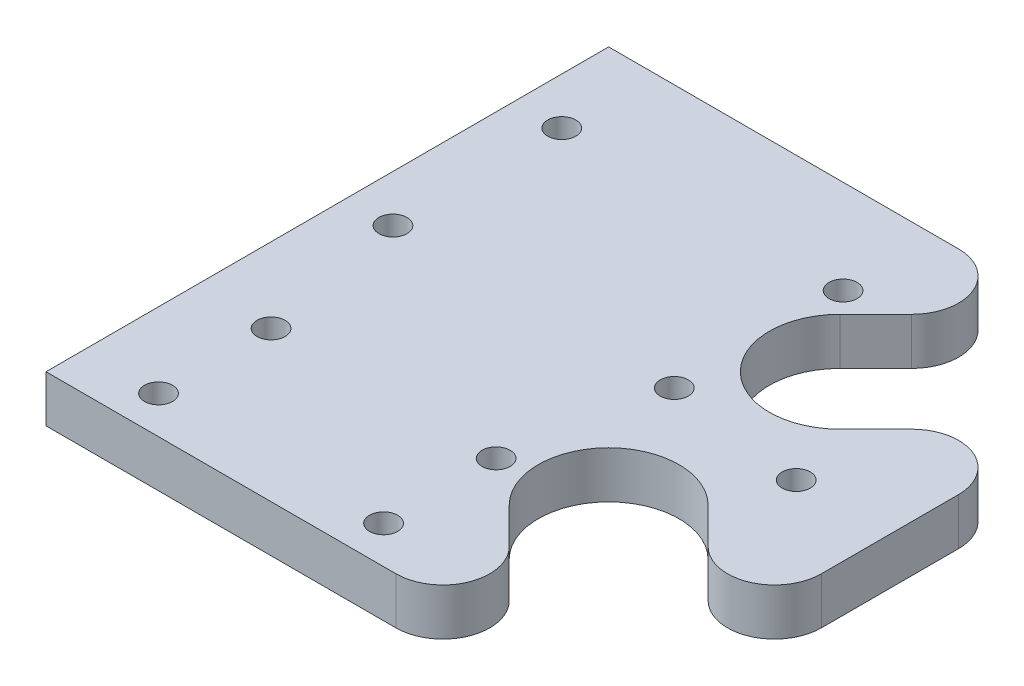
ISO-10303-21;
HEADER;
FILE_DESCRIPTION(('STEP AP214'),'2;1');
FILE_NAME('part.step','',(''),(''),'','','');
FILE_SCHEMA(('AUTOMOTIVE_DESIGN { 1 0 10303 214 1 1 1 1 }'));
ENDSEC;
DATA;
#1=APPLICATION_CONTEXT('core data for automotive mechanical design processes');
#2=APPLICATION_PROTOCOL_DEFINITION('international standard','automotive_design',2000,#1);
#3=PRODUCT_CONTEXT('',#1,'mechanical');
#4=PRODUCT('Part','Part','',(#3));
#5=PRODUCT_RELATED_PRODUCT_CATEGORY('part','',(#4));
#6=PRODUCT_DEFINITION_FORMATION('','',#4);
#7=PRODUCT_DEFINITION_CONTEXT('part definition',#1,'design');
#8=PRODUCT_DEFINITION('design','',#6,#7);
#9=PRODUCT_DEFINITION_SHAPE('','',#8);
#10=(LENGTH_UNIT() NAMED_UNIT(*) SI_UNIT(.MILLI.,.METRE.));
#11=(NAMED_UNIT(*) PLANE_ANGLE_UNIT() SI_UNIT($,.RADIAN.));
#12=(NAMED_UNIT(*) SI_UNIT($,.STERADIAN.) SOLID_ANGLE_UNIT());
#13=UNCERTAINTY_MEASURE_WITH_UNIT(LENGTH_MEASURE(1.E-05),#10,'distance_accuracy_value','');
#14=(GEOMETRIC_REPRESENTATION_CONTEXT(3) GLOBAL_UNCERTAINTY_ASSIGNED_CONTEXT((#13)) GLOBAL_UNIT_ASSIGNED_CONTEXT((#10,
#11,#12)) REPRESENTATION_CONTEXT('',''));
#15=CARTESIAN_POINT('',(0.,0.,0.));
#16=DIRECTION('',(0.,0.,1.));
#17=DIRECTION('',(1.,0.,0.));
#18=AXIS2_PLACEMENT_3D('',#15,#16,#17);
#19=CARTESIAN_POINT('',(30.,5.,30.));
#20=DIRECTION('',(-1.,0.,0.));
#21=DIRECTION('',(0.,0.,1.));
#22=AXIS2_PLACEMENT_3D('',#19,#20,#21);
#23=PLANE('',#22);
#24=DIRECTION('',(0.,0.,-1.));
#25=VECTOR('',#24,1.);
#26=CARTESIAN_POINT('',(30.,0.,30.));
#27=LINE('',#26,#25);
#28=CARTESIAN_POINT('',(30.,0.,7.32233047033629));
#29=VERTEX_POINT('',#28);
#30=CARTESIAN_POINT('',(30.,0.,-7.32233047033629));
#31=VERTEX_POINT('',#30);
#32=EDGE_CURVE('E147',#29,#31,#27,.T.);
#33=ORIENTED_EDGE('',*,*,#32,.T.);
#34=DIRECTION('',(0.,1.,0.));
#35=VECTOR('',#34,1.);
#36=CARTESIAN_POINT('',(30.,5.,-7.32233047033629));
#37=LINE('',#36,#35);
#38=CARTESIAN_POINT('',(30.,5.,-7.32233047033629));
#39=VERTEX_POINT('',#38);
#40=EDGE_CURVE('E218',#31,#39,#37,.T.);
#41=ORIENTED_EDGE('',*,*,#40,.T.);
#42=DIRECTION('',(0.,0.,-1.));
#43=VECTOR('',#42,1.);
#44=CARTESIAN_POINT('',(30.,5.,30.));
#45=LINE('',#44,#43);
#46=CARTESIAN_POINT('',(30.,5.,7.32233047033629));
#47=VERTEX_POINT('',#46);
#48=EDGE_CURVE('E191',#47,#39,#45,.T.);
#49=ORIENTED_EDGE('',*,*,#48,.F.);
#50=DIRECTION('',(0.,1.,0.));
#51=VECTOR('',#50,1.);
#52=CARTESIAN_POINT('',(30.,5.,7.32233047033629));
#53=LINE('',#52,#51);
#54=EDGE_CURVE('E216',#47,#29,#53,.F.);
#55=ORIENTED_EDGE('',*,*,#54,.T.);
#56=EDGE_LOOP('',(#33,#41,#49,#55));
#57=FACE_BOUND('',#56,.T.);
#58=ADVANCED_FACE('F35',(#57),#23,.F.);
#59=CARTESIAN_POINT('',(-30.,5.,-30.));
#60=DIRECTION('',(0.,0.,1.));
#61=DIRECTION('',(1.,0.,0.));
#62=AXIS2_PLACEMENT_3D('',#59,#60,#61);
#63=PLANE('',#62);
#64=DIRECTION('',(-1.,0.,0.));
#65=VECTOR('',#64,1.);
#66=CARTESIAN_POINT('',(-30.,5.,-30.));
#67=LINE('',#66,#65);
#68=CARTESIAN_POINT('',(7.32233047033629,5.,-30.));
#69=VERTEX_POINT('',#68);
#70=CARTESIAN_POINT('',(-30.,5.,-30.));
#71=VERTEX_POINT('',#70);
#72=EDGE_CURVE('E194',#69,#71,#67,.T.);
#73=ORIENTED_EDGE('',*,*,#72,.F.);
#74=DIRECTION('',(0.,1.,0.));
#75=VECTOR('',#74,1.);
#76=CARTESIAN_POINT('',(7.32233047033629,5.,-30.));
#77=LINE('',#76,#75);
#78=CARTESIAN_POINT('',(7.32233047033629,0.,-30.));
#79=VERTEX_POINT('',#78);
#80=EDGE_CURVE('E11',#69,#79,#77,.F.);
#81=ORIENTED_EDGE('',*,*,#80,.T.);
#82=DIRECTION('',(-1.,0.,0.));
#83=VECTOR('',#82,1.);
#84=CARTESIAN_POINT('',(-30.,0.,-30.));
#85=LINE('',#84,#83);
#86=CARTESIAN_POINT('',(-30.,0.,-30.));
#87=VERTEX_POINT('',#86);
#88=EDGE_CURVE('E205',#79,#87,#85,.T.);
#89=ORIENTED_EDGE('',*,*,#88,.T.);
#90=DIRECTION('',(0.,-1.,0.));
#91=VECTOR('',#90,1.);
#92=CARTESIAN_POINT('',(-30.,5.,-30.));
#93=LINE('',#92,#91);
#94=EDGE_CURVE('E213',#71,#87,#93,.T.);
#95=ORIENTED_EDGE('',*,*,#94,.F.);
#96=EDGE_LOOP('',(#73,#81,#89,#95));
#97=FACE_BOUND('',#96,.T.);
#98=ADVANCED_FACE('F301',(#97),#63,.F.);
#99=CARTESIAN_POINT('',(-30.,5.,30.));
#100=DIRECTION('',(1.,0.,0.));
#101=DIRECTION('',(0.,0.,-1.));
#102=AXIS2_PLACEMENT_3D('',#99,#100,#101);
#103=PLANE('',#102);
#104=DIRECTION('',(0.,0.,1.));
#105=VECTOR('',#104,1.);
#106=CARTESIAN_POINT('',(-30.,0.,30.));
#107=LINE('',#106,#105);
#108=CARTESIAN_POINT('',(-30.,0.,30.));
#109=VERTEX_POINT('',#108);
#110=EDGE_CURVE('E207',#87,#109,#107,.T.);
#111=ORIENTED_EDGE('',*,*,#110,.T.);
#112=DIRECTION('',(0.,-1.,0.));
#113=VECTOR('',#112,1.);
#114=CARTESIAN_POINT('',(-30.,5.,30.));
#115=LINE('',#114,#113);
#116=CARTESIAN_POINT('',(-30.,5.,30.));
#117=VERTEX_POINT('',#116);
#118=EDGE_CURVE('E202',#117,#109,#115,.T.);
#119=ORIENTED_EDGE('',*,*,#118,.F.);
#120=DIRECTION('',(0.,0.,1.));
#121=VECTOR('',#120,1.);
#122=CARTESIAN_POINT('',(-30.,5.,30.));
#123=LINE('',#122,#121);
#124=EDGE_CURVE('E197',#71,#117,#123,.T.);
#125=ORIENTED_EDGE('',*,*,#124,.F.);
#126=ORIENTED_EDGE('',*,*,#94,.T.);
#127=EDGE_LOOP('',(#111,#119,#125,#126));
#128=FACE_BOUND('',#127,.T.);
#129=ADVANCED_FACE('F289',(#128),#103,.F.);
#130=CARTESIAN_POINT('',(-30.,5.,30.));
#131=DIRECTION('',(0.,0.,-1.));
#132=DIRECTION('',(-1.,0.,0.));
#133=AXIS2_PLACEMENT_3D('',#130,#131,#132);
#134=PLANE('',#133);
#135=DIRECTION('',(1.,0.,0.));
#136=VECTOR('',#135,1.);
#137=CARTESIAN_POINT('',(-30.,0.,30.));
#138=LINE('',#137,#136);
#139=CARTESIAN_POINT('',(7.32233047033629,0.,30.));
#140=VERTEX_POINT('',#139);
#141=EDGE_CURVE('E195',#109,#140,#138,.T.);
#142=ORIENTED_EDGE('',*,*,#141,.T.);
#143=DIRECTION('',(0.,1.,0.));
#144=VECTOR('',#143,1.);
#145=CARTESIAN_POINT('',(7.32233047033629,5.,30.));
#146=LINE('',#145,#144);
#147=CARTESIAN_POINT('',(7.32233047033629,5.,30.));
#148=VERTEX_POINT('',#147);
#149=EDGE_CURVE('E240',#140,#148,#146,.T.);
#150=ORIENTED_EDGE('',*,*,#149,.T.);
#151=DIRECTION('',(1.,0.,0.));
#152=VECTOR('',#151,1.);
#153=CARTESIAN_POINT('',(-30.,5.,30.));
#154=LINE('',#153,#152);
#155=EDGE_CURVE('E199',#117,#148,#154,.T.);
#156=ORIENTED_EDGE('',*,*,#155,.F.);
#157=ORIENTED_EDGE('',*,*,#118,.T.);
#158=EDGE_LOOP('',(#142,#150,#156,#157));
#159=FACE_BOUND('',#158,.T.);
#160=ADVANCED_FACE('F284',(#159),#134,.F.);
#161=CARTESIAN_POINT('',(0.,5.,0.));
#162=DIRECTION('',(0.,-1.,0.));
#163=DIRECTION('',(0.,0.,-1.));
#164=AXIS2_PLACEMENT_3D('',#161,#162,#163);
#165=PLANE('',#164);
#166=CARTESIAN_POINT('',(-22.,5.,26.));
#167=DIRECTION('',(0.,1.,0.));
#168=DIRECTION('',(0.,0.,-1.));
#169=AXIS2_PLACEMENT_3D('',#166,#167,#168);
#170=CIRCLE('',#169,1.5);
#171=CARTESIAN_POINT('',(-22.,5.,24.5));
#172=VERTEX_POINT('',#171);
#173=EDGE_CURVE('E516',#172,#172,#170,.T.);
#174=ORIENTED_EDGE('',*,*,#173,.F.);
#175=EDGE_LOOP('',(#174));
#176=FACE_BOUND('',#175,.T.);
#177=CARTESIAN_POINT('',(1.99999999999999,5.,26.));
#178=DIRECTION('',(0.,1.,0.));
#179=DIRECTION('',(0.,0.,1.));
#180=AXIS2_PLACEMENT_3D('',#177,#178,#179);
#181=CIRCLE('',#180,1.50000000000002);
#182=CARTESIAN_POINT('',(1.99999999999999,5.,27.5));
#183=VERTEX_POINT('',#182);
#184=EDGE_CURVE('E518',#183,#183,#181,.T.);
#185=ORIENTED_EDGE('',*,*,#184,.F.);
#186=EDGE_LOOP('',(#185));
#187=FACE_BOUND('',#186,.T.);
#188=CARTESIAN_POINT('',(1.99999999999999,5.,14.));
#189=DIRECTION('',(0.,1.,0.));
#190=DIRECTION('',(0.,0.,-1.));
#191=AXIS2_PLACEMENT_3D('',#188,#189,#190);
#192=CIRCLE('',#191,1.50000000000002);
#193=CARTESIAN_POINT('',(1.99999999999999,5.,12.5));
#194=VERTEX_POINT('',#193);
#195=EDGE_CURVE('E555',#194,#194,#192,.T.);
#196=ORIENTED_EDGE('',*,*,#195,.F.);
#197=EDGE_LOOP('',(#196));
#198=FACE_BOUND('',#197,.T.);
#199=CARTESIAN_POINT('',(-22.,5.,14.));
#200=DIRECTION('',(0.,1.,0.));
#201=DIRECTION('',(0.,0.,1.));
#202=AXIS2_PLACEMENT_3D('',#199,#200,#201);
#203=CIRCLE('',#202,1.5);
#204=CARTESIAN_POINT('',(-22.,5.,15.5));
#205=VERTEX_POINT('',#204);
#206=EDGE_CURVE('E549',#205,#205,#203,.T.);
#207=ORIENTED_EDGE('',*,*,#206,.F.);
#208=EDGE_LOOP('',(#207));
#209=FACE_BOUND('',#208,.T.);
#210=CARTESIAN_POINT('',(4.99999999999998,5.,-20.));
#211=DIRECTION('',(0.,1.,0.));
#212=DIRECTION('',(0.,0.,-1.));
#213=AXIS2_PLACEMENT_3D('',#210,#211,#212);
#214=CIRCLE('',#213,1.5);
#215=CARTESIAN_POINT('',(4.99999999999998,5.,-21.5));
#216=VERTEX_POINT('',#215);
#217=EDGE_CURVE('E529',#216,#216,#214,.T.);
#218=ORIENTED_EDGE('',*,*,#217,.F.);
#219=EDGE_LOOP('',(#218));
#220=FACE_BOUND('',#219,.T.);
#221=CARTESIAN_POINT('',(-25.,5.,-1.99999999999999));
#222=DIRECTION('',(0.,1.,0.));
#223=DIRECTION('',(0.,0.,1.));
#224=AXIS2_PLACEMENT_3D('',#221,#222,#223);
#225=CIRCLE('',#224,1.5);
#226=CARTESIAN_POINT('',(-25.,5.,-0.499999999999994));
#227=VERTEX_POINT('',#226);
#228=EDGE_CURVE('E542',#227,#227,#225,.T.);
#229=ORIENTED_EDGE('',*,*,#228,.F.);
#230=EDGE_LOOP('',(#229));
#231=FACE_BOUND('',#230,.T.);
#232=CARTESIAN_POINT('',(4.99999999999998,5.,-2.));
#233=DIRECTION('',(0.,1.,0.));
#234=DIRECTION('',(0.,0.,1.));
#235=AXIS2_PLACEMENT_3D('',#232,#233,#234);
#236=CIRCLE('',#235,1.5);
#237=CARTESIAN_POINT('',(4.99999999999998,5.,-0.499999999999999));
#238=VERTEX_POINT('',#237);
#239=EDGE_CURVE('E576',#238,#238,#236,.T.);
#240=ORIENTED_EDGE('',*,*,#239,.F.);
#241=EDGE_LOOP('',(#240));
#242=FACE_BOUND('',#241,.T.);
#243=CARTESIAN_POINT('',(20.,5.,0.));
#244=DIRECTION('',(0.,1.,0.));
#245=DIRECTION('',(0.,0.,1.));
#246=AXIS2_PLACEMENT_3D('',#243,#244,#245);
#247=CIRCLE('',#246,1.5);
#248=CARTESIAN_POINT('',(20.,5.,1.5));
#249=VERTEX_POINT('',#248);
#250=EDGE_CURVE('E537',#249,#249,#247,.T.);
#251=ORIENTED_EDGE('',*,*,#250,.F.);
#252=EDGE_LOOP('',(#251));
#253=FACE_BOUND('',#252,.T.);
#254=CARTESIAN_POINT('',(-25.,5.,-20.));
#255=DIRECTION('',(0.,1.,0.));
#256=DIRECTION('',(0.,0.,1.));
#257=AXIS2_PLACEMENT_3D('',#254,#255,#256);
#258=CIRCLE('',#257,1.5);
#259=CARTESIAN_POINT('',(-25.,5.,-18.5));
#260=VERTEX_POINT('',#259);
#261=EDGE_CURVE('E523',#260,#260,#258,.T.);
#262=ORIENTED_EDGE('',*,*,#261,.F.);
#263=EDGE_LOOP('',(#262));
#264=FACE_BOUND('',#263,.T.);
#265=ORIENTED_EDGE('',*,*,#48,.T.);
#266=CARTESIAN_POINT('',(25.,5.,-7.32233047033629));
#267=DIRECTION('',(0.,-1.,0.));
#268=DIRECTION('',(0.,0.,-1.));
#269=AXIS2_PLACEMENT_3D('',#266,#267,#268);
#270=CIRCLE('',#269,5.);
#271=CARTESIAN_POINT('',(21.4644660940673,5.,-10.857864376269));
#272=VERTEX_POINT('',#271);
#273=EDGE_CURVE('E227',#39,#272,#270,.F.);
#274=ORIENTED_EDGE('',*,*,#273,.T.);
#275=DIRECTION('',(0.707106781186549,0.,-0.707106781186546));
#276=VECTOR('',#275,1.);
#277=CARTESIAN_POINT('',(30.,5.,-19.3933982822017));
#278=LINE('',#277,#276);
#279=CARTESIAN_POINT('',(17.6256313292354,5.,-7.01902961143719));
#280=VERTEX_POINT('',#279);
#281=EDGE_CURVE('E160',#280,#272,#278,.T.);
#282=ORIENTED_EDGE('',*,*,#281,.F.);
#283=CARTESIAN_POINT('',(12.3223304703363,5.,-12.3223304703363));
#284=DIRECTION('',(0.,1.,0.));
#285=DIRECTION('',(0.,0.,1.));
#286=AXIS2_PLACEMENT_3D('',#283,#284,#285);
#287=CIRCLE('',#286,7.5);
#288=CARTESIAN_POINT('',(7.01902961143719,5.,-17.6256313292354));
#289=VERTEX_POINT('',#288);
#290=EDGE_CURVE('E143',#289,#280,#287,.T.);
#291=ORIENTED_EDGE('',*,*,#290,.F.);
#292=DIRECTION('',(-0.707106781186546,0.,0.707106781186549));
#293=VECTOR('',#292,1.);
#294=CARTESIAN_POINT('',(19.3933982822017,5.,-30.));
#295=LINE('',#294,#293);
#296=CARTESIAN_POINT('',(10.857864376269,5.,-21.4644660940673));
#297=VERTEX_POINT('',#296);
#298=EDGE_CURVE('E164',#297,#289,#295,.T.);
#299=ORIENTED_EDGE('',*,*,#298,.F.);
#300=CARTESIAN_POINT('',(7.32233047033629,5.,-25.));
#301=DIRECTION('',(0.,-1.,0.));
#302=DIRECTION('',(0.,0.,-1.));
#303=AXIS2_PLACEMENT_3D('',#300,#301,#302);
#304=CIRCLE('',#303,5.);
#305=EDGE_CURVE('E221',#297,#69,#304,.F.);
#306=ORIENTED_EDGE('',*,*,#305,.T.);
#307=ORIENTED_EDGE('',*,*,#72,.T.);
#308=ORIENTED_EDGE('',*,*,#124,.T.);
#309=ORIENTED_EDGE('',*,*,#155,.T.);
#310=CARTESIAN_POINT('',(7.32233047033629,5.,25.));
#311=DIRECTION('',(0.,-1.,0.));
#312=DIRECTION('',(0.,0.,-1.));
#313=AXIS2_PLACEMENT_3D('',#310,#311,#312);
#314=CIRCLE('',#313,5.);
#315=CARTESIAN_POINT('',(10.857864376269,5.,21.4644660940673));
#316=VERTEX_POINT('',#315);
#317=EDGE_CURVE('E223',#148,#316,#314,.F.);
#318=ORIENTED_EDGE('',*,*,#317,.T.);
#319=DIRECTION('',(0.707106781186546,0.,0.707106781186549));
#320=VECTOR('',#319,1.);
#321=CARTESIAN_POINT('',(19.3933982822017,5.,30.));
#322=LINE('',#321,#320);
#323=CARTESIAN_POINT('',(7.01902961143719,5.,17.6256313292354));
#324=VERTEX_POINT('',#323);
#325=EDGE_CURVE('E180',#324,#316,#322,.T.);
#326=ORIENTED_EDGE('',*,*,#325,.F.);
#327=CARTESIAN_POINT('',(12.3223304703363,5.,12.3223304703363));
#328=DIRECTION('',(0.,1.,0.));
#329=DIRECTION('',(0.,0.,-1.));
#330=AXIS2_PLACEMENT_3D('',#327,#328,#329);
#331=CIRCLE('',#330,7.5);
#332=CARTESIAN_POINT('',(17.6256313292354,5.,7.01902961143719));
#333=VERTEX_POINT('',#332);
#334=EDGE_CURVE('E174',#333,#324,#331,.T.);
#335=ORIENTED_EDGE('',*,*,#334,.F.);
#336=DIRECTION('',(-0.707106781186549,0.,-0.707106781186546));
#337=VECTOR('',#336,1.);
#338=CARTESIAN_POINT('',(30.,5.,19.3933982822017));
#339=LINE('',#338,#337);
#340=CARTESIAN_POINT('',(21.4644660940673,5.,10.857864376269));
#341=VERTEX_POINT('',#340);
#342=EDGE_CURVE('E183',#341,#333,#339,.T.);
#343=ORIENTED_EDGE('',*,*,#342,.F.);
#344=CARTESIAN_POINT('',(25.,5.,7.32233047033629));
#345=DIRECTION('',(0.,-1.,0.));
#346=DIRECTION('',(0.,0.,-1.));
#347=AXIS2_PLACEMENT_3D('',#344,#345,#346);
#348=CIRCLE('',#347,5.);
#349=EDGE_CURVE('E225',#341,#47,#348,.F.);
#350=ORIENTED_EDGE('',*,*,#349,.T.);
#351=EDGE_LOOP('',(#265,#274,#282,#291,#299,#306,#307,#308,#309,#318,#326,#335,#343,#350));
#352=FACE_BOUND('',#351,.T.);
#353=ADVANCED_FACE('F251',(#176,#187,#198,#209,#220,#231,#242,#253,#264,#352),#165,.F.);
#354=CARTESIAN_POINT('',(0.,0.,0.));
#355=DIRECTION('',(0.,-1.,0.));
#356=DIRECTION('',(0.,0.,-1.));
#357=AXIS2_PLACEMENT_3D('',#354,#355,#356);
#358=PLANE('',#357);
#359=CARTESIAN_POINT('',(-22.,0.,26.));
#360=DIRECTION('',(0.,1.,0.));
#361=DIRECTION('',(0.,0.,-1.));
#362=AXIS2_PLACEMENT_3D('',#359,#360,#361);
#363=CIRCLE('',#362,1.5);
#364=CARTESIAN_POINT('',(-22.,0.,24.5));
#365=VERTEX_POINT('',#364);
#366=EDGE_CURVE('E513',#365,#365,#363,.T.);
#367=ORIENTED_EDGE('',*,*,#366,.T.);
#368=EDGE_LOOP('',(#367));
#369=FACE_BOUND('',#368,.T.);
#370=CARTESIAN_POINT('',(1.99999999999999,0.,26.));
#371=DIRECTION('',(0.,1.,0.));
#372=DIRECTION('',(0.,0.,1.));
#373=AXIS2_PLACEMENT_3D('',#370,#371,#372);
#374=CIRCLE('',#373,1.50000000000002);
#375=CARTESIAN_POINT('',(1.99999999999999,0.,27.5));
#376=VERTEX_POINT('',#375);
#377=EDGE_CURVE('E558',#376,#376,#374,.T.);
#378=ORIENTED_EDGE('',*,*,#377,.T.);
#379=EDGE_LOOP('',(#378));
#380=FACE_BOUND('',#379,.T.);
#381=CARTESIAN_POINT('',(1.99999999999999,0.,14.));
#382=DIRECTION('',(0.,1.,0.));
#383=DIRECTION('',(0.,0.,-1.));
#384=AXIS2_PLACEMENT_3D('',#381,#382,#383);
#385=CIRCLE('',#384,1.50000000000002);
#386=CARTESIAN_POINT('',(1.99999999999999,0.,12.5));
#387=VERTEX_POINT('',#386);
#388=EDGE_CURVE('E552',#387,#387,#385,.T.);
#389=ORIENTED_EDGE('',*,*,#388,.T.);
#390=EDGE_LOOP('',(#389));
#391=FACE_BOUND('',#390,.T.);
#392=CARTESIAN_POINT('',(-22.,0.,14.));
#393=DIRECTION('',(0.,1.,0.));
#394=DIRECTION('',(0.,0.,1.));
#395=AXIS2_PLACEMENT_3D('',#392,#393,#394);
#396=CIRCLE('',#395,1.5);
#397=CARTESIAN_POINT('',(-22.,0.,15.5));
#398=VERTEX_POINT('',#397);
#399=EDGE_CURVE('E546',#398,#398,#396,.T.);
#400=ORIENTED_EDGE('',*,*,#399,.T.);
#401=EDGE_LOOP('',(#400));
#402=FACE_BOUND('',#401,.T.);
#403=CARTESIAN_POINT('',(4.99999999999998,0.,-20.));
#404=DIRECTION('',(0.,1.,0.));
#405=DIRECTION('',(0.,0.,-1.));
#406=AXIS2_PLACEMENT_3D('',#403,#404,#405);
#407=CIRCLE('',#406,1.5);
#408=CARTESIAN_POINT('',(4.99999999999998,0.,-21.5));
#409=VERTEX_POINT('',#408);
#410=EDGE_CURVE('E525',#409,#409,#407,.T.);
#411=ORIENTED_EDGE('',*,*,#410,.T.);
#412=EDGE_LOOP('',(#411));
#413=FACE_BOUND('',#412,.T.);
#414=CARTESIAN_POINT('',(-25.,0.,-1.99999999999999));
#415=DIRECTION('',(0.,1.,0.));
#416=DIRECTION('',(0.,0.,1.));
#417=AXIS2_PLACEMENT_3D('',#414,#415,#416);
#418=CIRCLE('',#417,1.5);
#419=CARTESIAN_POINT('',(-25.,0.,-0.499999999999994));
#420=VERTEX_POINT('',#419);
#421=EDGE_CURVE('E534',#420,#420,#418,.T.);
#422=ORIENTED_EDGE('',*,*,#421,.T.);
#423=EDGE_LOOP('',(#422));
#424=FACE_BOUND('',#423,.T.);
#425=CARTESIAN_POINT('',(4.99999999999998,0.,-2.));
#426=DIRECTION('',(0.,1.,0.));
#427=DIRECTION('',(0.,0.,1.));
#428=AXIS2_PLACEMENT_3D('',#425,#426,#427);
#429=CIRCLE('',#428,1.5);
#430=CARTESIAN_POINT('',(4.99999999999998,0.,-0.499999999999999));
#431=VERTEX_POINT('',#430);
#432=EDGE_CURVE('E545',#431,#431,#429,.T.);
#433=ORIENTED_EDGE('',*,*,#432,.T.);
#434=EDGE_LOOP('',(#433));
#435=FACE_BOUND('',#434,.T.);
#436=CARTESIAN_POINT('',(20.,0.,0.));
#437=DIRECTION('',(0.,1.,0.));
#438=DIRECTION('',(0.,0.,1.));
#439=AXIS2_PLACEMENT_3D('',#436,#437,#438);
#440=CIRCLE('',#439,1.5);
#441=CARTESIAN_POINT('',(20.,0.,1.5));
#442=VERTEX_POINT('',#441);
#443=EDGE_CURVE('E581',#442,#442,#440,.T.);
#444=ORIENTED_EDGE('',*,*,#443,.T.);
#445=EDGE_LOOP('',(#444));
#446=FACE_BOUND('',#445,.T.);
#447=CARTESIAN_POINT('',(-25.,0.,-20.));
#448=DIRECTION('',(0.,1.,0.));
#449=DIRECTION('',(0.,0.,1.));
#450=AXIS2_PLACEMENT_3D('',#447,#448,#449);
#451=CIRCLE('',#450,1.5);
#452=CARTESIAN_POINT('',(-25.,0.,-18.5));
#453=VERTEX_POINT('',#452);
#454=EDGE_CURVE('E184',#453,#453,#451,.T.);
#455=ORIENTED_EDGE('',*,*,#454,.T.);
#456=EDGE_LOOP('',(#455));
#457=FACE_BOUND('',#456,.T.);
#458=DIRECTION('',(0.707106781186549,0.,-0.707106781186546));
#459=VECTOR('',#458,1.);
#460=CARTESIAN_POINT('',(30.,0.,-19.3933982822017));
#461=LINE('',#460,#459);
#462=CARTESIAN_POINT('',(17.6256313292354,0.,-7.01902961143719));
#463=VERTEX_POINT('',#462);
#464=CARTESIAN_POINT('',(21.4644660940673,0.,-10.857864376269));
#465=VERTEX_POINT('',#464);
#466=EDGE_CURVE('E151',#463,#465,#461,.T.);
#467=ORIENTED_EDGE('',*,*,#466,.T.);
#468=CARTESIAN_POINT('',(25.,0.,-7.32233047033629));
#469=DIRECTION('',(0.,-1.,0.));
#470=DIRECTION('',(0.,0.,-1.));
#471=AXIS2_PLACEMENT_3D('',#468,#469,#470);
#472=CIRCLE('',#471,5.);
#473=EDGE_CURVE('E235',#465,#31,#472,.T.);
#474=ORIENTED_EDGE('',*,*,#473,.T.);
#475=ORIENTED_EDGE('',*,*,#32,.F.);
#476=CARTESIAN_POINT('',(25.,0.,7.32233047033629));
#477=DIRECTION('',(0.,-1.,0.));
#478=DIRECTION('',(0.,0.,-1.));
#479=AXIS2_PLACEMENT_3D('',#476,#477,#478);
#480=CIRCLE('',#479,5.);
#481=CARTESIAN_POINT('',(21.4644660940673,0.,10.857864376269));
#482=VERTEX_POINT('',#481);
#483=EDGE_CURVE('E233',#29,#482,#480,.T.);
#484=ORIENTED_EDGE('',*,*,#483,.T.);
#485=DIRECTION('',(-0.707106781186549,0.,-0.707106781186546));
#486=VECTOR('',#485,1.);
#487=CARTESIAN_POINT('',(30.,0.,19.3933982822017));
#488=LINE('',#487,#486);
#489=CARTESIAN_POINT('',(17.6256313292354,0.,7.01902961143719));
#490=VERTEX_POINT('',#489);
#491=EDGE_CURVE('E173',#482,#490,#488,.T.);
#492=ORIENTED_EDGE('',*,*,#491,.T.);
#493=CARTESIAN_POINT('',(12.3223304703363,0.,12.3223304703363));
#494=DIRECTION('',(0.,1.,0.));
#495=DIRECTION('',(0.,0.,-1.));
#496=AXIS2_PLACEMENT_3D('',#493,#494,#495);
#497=CIRCLE('',#496,7.5);
#498=CARTESIAN_POINT('',(7.01902961143719,0.,17.6256313292354));
#499=VERTEX_POINT('',#498);
#500=EDGE_CURVE('E176',#490,#499,#497,.T.);
#501=ORIENTED_EDGE('',*,*,#500,.T.);
#502=DIRECTION('',(0.707106781186546,0.,0.707106781186549));
#503=VECTOR('',#502,1.);
#504=CARTESIAN_POINT('',(19.3933982822017,0.,30.));
#505=LINE('',#504,#503);
#506=CARTESIAN_POINT('',(10.857864376269,0.,21.4644660940673));
#507=VERTEX_POINT('',#506);
#508=EDGE_CURVE('E170',#499,#507,#505,.T.);
#509=ORIENTED_EDGE('',*,*,#508,.T.);
#510=CARTESIAN_POINT('',(7.32233047033629,0.,25.));
#511=DIRECTION('',(0.,-1.,0.));
#512=DIRECTION('',(0.,0.,-1.));
#513=AXIS2_PLACEMENT_3D('',#510,#511,#512);
#514=CIRCLE('',#513,5.);
#515=EDGE_CURVE('E231',#507,#140,#514,.T.);
#516=ORIENTED_EDGE('',*,*,#515,.T.);
#517=ORIENTED_EDGE('',*,*,#141,.F.);
#518=ORIENTED_EDGE('',*,*,#110,.F.);
#519=ORIENTED_EDGE('',*,*,#88,.F.);
#520=CARTESIAN_POINT('',(7.32233047033629,0.,-25.));
#521=DIRECTION('',(0.,-1.,0.));
#522=DIRECTION('',(0.,0.,-1.));
#523=AXIS2_PLACEMENT_3D('',#520,#521,#522);
#524=CIRCLE('',#523,5.);
#525=CARTESIAN_POINT('',(10.857864376269,0.,-21.4644660940673));
#526=VERTEX_POINT('',#525);
#527=EDGE_CURVE('E50',#79,#526,#524,.T.);
#528=ORIENTED_EDGE('',*,*,#527,.T.);
#529=DIRECTION('',(-0.707106781186546,0.,0.707106781186549));
#530=VECTOR('',#529,1.);
#531=CARTESIAN_POINT('',(19.3933982822017,0.,-30.));
#532=LINE('',#531,#530);
#533=CARTESIAN_POINT('',(7.01902961143719,0.,-17.6256313292354));
#534=VERTEX_POINT('',#533);
#535=EDGE_CURVE('E158',#526,#534,#532,.T.);
#536=ORIENTED_EDGE('',*,*,#535,.T.);
#537=CARTESIAN_POINT('',(12.3223304703363,0.,-12.3223304703363));
#538=DIRECTION('',(0.,1.,0.));
#539=DIRECTION('',(0.,0.,1.));
#540=AXIS2_PLACEMENT_3D('',#537,#538,#539);
#541=CIRCLE('',#540,7.5);
#542=EDGE_CURVE('E140',#534,#463,#541,.T.);
#543=ORIENTED_EDGE('',*,*,#542,.T.);
#544=EDGE_LOOP('',(#467,#474,#475,#484,#492,#501,#509,#516,#517,#518,#519,#528,#536,#543));
#545=FACE_BOUND('',#544,.T.);
#546=ADVANCED_FACE('F157',(#369,#380,#391,#402,#413,#424,#435,#446,#457,#545),#358,.T.);
#547=CARTESIAN_POINT('',(19.3933982822017,0.,30.));
#548=DIRECTION('',(-0.707106781186549,0.,0.707106781186546));
#549=DIRECTION('',(0.707106781186546,0.,0.707106781186549));
#550=AXIS2_PLACEMENT_3D('',#547,#548,#549);
#551=PLANE('',#550);
#552=ORIENTED_EDGE('',*,*,#325,.T.);
#553=DIRECTION('',(0.,1.,0.));
#554=VECTOR('',#553,1.);
#555=CARTESIAN_POINT('',(10.857864376269,0.,21.4644660940673));
#556=LINE('',#555,#554);
#557=EDGE_CURVE('E243',#316,#507,#556,.F.);
#558=ORIENTED_EDGE('',*,*,#557,.T.);
#559=ORIENTED_EDGE('',*,*,#508,.F.);
#560=DIRECTION('',(0.,1.,0.));
#561=VECTOR('',#560,1.);
#562=CARTESIAN_POINT('',(7.01902961143719,0.,17.6256313292354));
#563=LINE('',#562,#561);
#564=EDGE_CURVE('E166',#499,#324,#563,.T.);
#565=ORIENTED_EDGE('',*,*,#564,.T.);
#566=EDGE_LOOP('',(#552,#558,#559,#565));
#567=FACE_BOUND('',#566,.T.);
#568=ADVANCED_FACE('F275',(#567),#551,.F.);
#569=CARTESIAN_POINT('',(12.3223304703363,0.,12.3223304703363));
#570=DIRECTION('',(0.,1.,0.));
#571=DIRECTION('',(0.,0.,1.));
#572=AXIS2_PLACEMENT_3D('',#569,#570,#571);
#573=CYLINDRICAL_SURFACE('',#572,7.5);
#574=ORIENTED_EDGE('',*,*,#334,.T.);
#575=ORIENTED_EDGE('',*,*,#564,.F.);
#576=ORIENTED_EDGE('',*,*,#500,.F.);
#577=DIRECTION('',(0.,1.,0.));
#578=VECTOR('',#577,1.);
#579=CARTESIAN_POINT('',(17.6256313292354,0.,7.01902961143719));
#580=LINE('',#579,#578);
#581=EDGE_CURVE('E179',#490,#333,#580,.T.);
#582=ORIENTED_EDGE('',*,*,#581,.T.);
#583=EDGE_LOOP('',(#574,#575,#576,#582));
#584=FACE_BOUND('',#583,.T.);
#585=ADVANCED_FACE('F271',(#584),#573,.F.);
#586=CARTESIAN_POINT('',(30.,0.,19.3933982822017));
#587=DIRECTION('',(0.707106781186546,0.,-0.707106781186549));
#588=DIRECTION('',(-0.707106781186549,0.,-0.707106781186546));
#589=AXIS2_PLACEMENT_3D('',#586,#587,#588);
#590=PLANE('',#589);
#591=ORIENTED_EDGE('',*,*,#491,.F.);
#592=DIRECTION('',(0.,1.,0.));
#593=VECTOR('',#592,1.);
#594=CARTESIAN_POINT('',(21.4644660940673,0.,10.857864376269));
#595=LINE('',#594,#593);
#596=EDGE_CURVE('E237',#482,#341,#595,.T.);
#597=ORIENTED_EDGE('',*,*,#596,.T.);
#598=ORIENTED_EDGE('',*,*,#342,.T.);
#599=ORIENTED_EDGE('',*,*,#581,.F.);
#600=EDGE_LOOP('',(#591,#597,#598,#599));
#601=FACE_BOUND('',#600,.T.);
#602=ADVANCED_FACE('F267',(#601),#590,.F.);
#603=CARTESIAN_POINT('',(30.,0.,-19.3933982822017));
#604=DIRECTION('',(0.707106781186546,0.,0.707106781186549));
#605=DIRECTION('',(0.707106781186549,0.,-0.707106781186546));
#606=AXIS2_PLACEMENT_3D('',#603,#604,#605);
#607=PLANE('',#606);
#608=ORIENTED_EDGE('',*,*,#281,.T.);
#609=DIRECTION('',(0.,1.,0.));
#610=VECTOR('',#609,1.);
#611=CARTESIAN_POINT('',(21.4644660940673,0.,-10.857864376269));
#612=LINE('',#611,#610);
#613=EDGE_CURVE('E154',#272,#465,#612,.F.);
#614=ORIENTED_EDGE('',*,*,#613,.T.);
#615=ORIENTED_EDGE('',*,*,#466,.F.);
#616=DIRECTION('',(0.,1.,0.));
#617=VECTOR('',#616,1.);
#618=CARTESIAN_POINT('',(17.6256313292354,0.,-7.01902961143719));
#619=LINE('',#618,#617);
#620=EDGE_CURVE('E135',#463,#280,#619,.T.);
#621=ORIENTED_EDGE('',*,*,#620,.T.);
#622=EDGE_LOOP('',(#608,#614,#615,#621));
#623=FACE_BOUND('',#622,.T.);
#624=ADVANCED_FACE('F152',(#623),#607,.F.);
#625=CARTESIAN_POINT('',(12.3223304703363,0.,-12.3223304703363));
#626=DIRECTION('',(0.,1.,0.));
#627=DIRECTION('',(0.,0.,1.));
#628=AXIS2_PLACEMENT_3D('',#625,#626,#627);
#629=CYLINDRICAL_SURFACE('',#628,7.5);
#630=ORIENTED_EDGE('',*,*,#290,.T.);
#631=ORIENTED_EDGE('',*,*,#620,.F.);
#632=ORIENTED_EDGE('',*,*,#542,.F.);
#633=DIRECTION('',(0.,1.,0.));
#634=VECTOR('',#633,1.);
#635=CARTESIAN_POINT('',(7.01902961143719,0.,-17.6256313292354));
#636=LINE('',#635,#634);
#637=EDGE_CURVE('E148',#534,#289,#636,.T.);
#638=ORIENTED_EDGE('',*,*,#637,.T.);
#639=EDGE_LOOP('',(#630,#631,#632,#638));
#640=FACE_BOUND('',#639,.T.);
#641=ADVANCED_FACE('F137',(#640),#629,.F.);
#642=CARTESIAN_POINT('',(19.3933982822017,0.,-30.));
#643=DIRECTION('',(-0.707106781186549,0.,-0.707106781186546));
#644=DIRECTION('',(-0.707106781186546,0.,0.707106781186549));
#645=AXIS2_PLACEMENT_3D('',#642,#643,#644);
#646=PLANE('',#645);
#647=ORIENTED_EDGE('',*,*,#535,.F.);
#648=DIRECTION('',(0.,1.,0.));
#649=VECTOR('',#648,1.);
#650=CARTESIAN_POINT('',(10.857864376269,0.,-21.4644660940673));
#651=LINE('',#650,#649);
#652=EDGE_CURVE('E43',#526,#297,#651,.T.);
#653=ORIENTED_EDGE('',*,*,#652,.T.);
#654=ORIENTED_EDGE('',*,*,#298,.T.);
#655=ORIENTED_EDGE('',*,*,#637,.F.);
#656=EDGE_LOOP('',(#647,#653,#654,#655));
#657=FACE_BOUND('',#656,.T.);
#658=ADVANCED_FACE('F248',(#657),#646,.F.);
#659=CARTESIAN_POINT('',(25.,5.,-7.32233047033629));
#660=DIRECTION('',(0.,1.,0.));
#661=DIRECTION('',(0.,0.,1.));
#662=AXIS2_PLACEMENT_3D('',#659,#660,#661);
#663=CYLINDRICAL_SURFACE('',#662,5.);
#664=ORIENTED_EDGE('',*,*,#473,.F.);
#665=ORIENTED_EDGE('',*,*,#613,.F.);
#666=ORIENTED_EDGE('',*,*,#273,.F.);
#667=ORIENTED_EDGE('',*,*,#40,.F.);
#668=EDGE_LOOP('',(#664,#665,#666,#667));
#669=FACE_BOUND('',#668,.T.);
#670=ADVANCED_FACE('F253',(#669),#663,.T.);
#671=CARTESIAN_POINT('',(25.,0.,7.32233047033629));
#672=DIRECTION('',(0.,1.,0.));
#673=DIRECTION('',(0.,0.,1.));
#674=AXIS2_PLACEMENT_3D('',#671,#672,#673);
#675=CYLINDRICAL_SURFACE('',#674,5.);
#676=ORIENTED_EDGE('',*,*,#483,.F.);
#677=ORIENTED_EDGE('',*,*,#54,.F.);
#678=ORIENTED_EDGE('',*,*,#349,.F.);
#679=ORIENTED_EDGE('',*,*,#596,.F.);
#680=EDGE_LOOP('',(#676,#677,#678,#679));
#681=FACE_BOUND('',#680,.T.);
#682=ADVANCED_FACE('F261',(#681),#675,.T.);
#683=CARTESIAN_POINT('',(7.32233047033629,5.,25.));
#684=DIRECTION('',(0.,1.,0.));
#685=DIRECTION('',(0.,0.,1.));
#686=AXIS2_PLACEMENT_3D('',#683,#684,#685);
#687=CYLINDRICAL_SURFACE('',#686,5.);
#688=ORIENTED_EDGE('',*,*,#515,.F.);
#689=ORIENTED_EDGE('',*,*,#557,.F.);
#690=ORIENTED_EDGE('',*,*,#317,.F.);
#691=ORIENTED_EDGE('',*,*,#149,.F.);
#692=EDGE_LOOP('',(#688,#689,#690,#691));
#693=FACE_BOUND('',#692,.T.);
#694=ADVANCED_FACE('F279',(#693),#687,.T.);
#695=CARTESIAN_POINT('',(7.32233047033629,0.,-25.));
#696=DIRECTION('',(0.,1.,0.));
#697=DIRECTION('',(0.,0.,1.));
#698=AXIS2_PLACEMENT_3D('',#695,#696,#697);
#699=CYLINDRICAL_SURFACE('',#698,5.);
#700=ORIENTED_EDGE('',*,*,#527,.F.);
#701=ORIENTED_EDGE('',*,*,#80,.F.);
#702=ORIENTED_EDGE('',*,*,#305,.F.);
#703=ORIENTED_EDGE('',*,*,#652,.F.);
#704=EDGE_LOOP('',(#700,#701,#702,#703));
#705=FACE_BOUND('',#704,.T.);
#706=ADVANCED_FACE('F37',(#705),#699,.T.);
#707=CARTESIAN_POINT('',(-25.,0.,-20.));
#708=DIRECTION('',(0.,1.,0.));
#709=DIRECTION('',(0.,0.,1.));
#710=AXIS2_PLACEMENT_3D('',#707,#708,#709);
#711=CYLINDRICAL_SURFACE('',#710,1.5);
#712=ORIENTED_EDGE('',*,*,#454,.F.);
#713=EDGE_LOOP('',(#712));
#714=FACE_BOUND('',#713,.T.);
#715=ORIENTED_EDGE('',*,*,#261,.T.);
#716=EDGE_LOOP('',(#715));
#717=FACE_BOUND('',#716,.T.);
#718=ADVANCED_FACE('F292',(#714,#717),#711,.F.);
#719=CARTESIAN_POINT('',(20.,0.,0.));
#720=DIRECTION('',(0.,1.,0.));
#721=DIRECTION('',(0.,0.,1.));
#722=AXIS2_PLACEMENT_3D('',#719,#720,#721);
#723=CYLINDRICAL_SURFACE('',#722,1.5);
#724=ORIENTED_EDGE('',*,*,#443,.F.);
#725=EDGE_LOOP('',(#724));
#726=FACE_BOUND('',#725,.T.);
#727=ORIENTED_EDGE('',*,*,#250,.T.);
#728=EDGE_LOOP('',(#727));
#729=FACE_BOUND('',#728,.T.);
#730=ADVANCED_FACE('F297',(#726,#729),#723,.F.);
#731=CARTESIAN_POINT('',(4.99999999999998,0.,-2.));
#732=DIRECTION('',(0.,1.,0.));
#733=DIRECTION('',(0.,0.,1.));
#734=AXIS2_PLACEMENT_3D('',#731,#732,#733);
#735=CYLINDRICAL_SURFACE('',#734,1.5);
#736=ORIENTED_EDGE('',*,*,#432,.F.);
#737=EDGE_LOOP('',(#736));
#738=FACE_BOUND('',#737,.T.);
#739=ORIENTED_EDGE('',*,*,#239,.T.);
#740=EDGE_LOOP('',(#739));
#741=FACE_BOUND('',#740,.T.);
#742=ADVANCED_FACE('F362',(#738,#741),#735,.F.);
#743=CARTESIAN_POINT('',(-25.,0.,-1.99999999999999));
#744=DIRECTION('',(0.,1.,0.));
#745=DIRECTION('',(0.,0.,1.));
#746=AXIS2_PLACEMENT_3D('',#743,#744,#745);
#747=CYLINDRICAL_SURFACE('',#746,1.5);
#748=ORIENTED_EDGE('',*,*,#421,.F.);
#749=EDGE_LOOP('',(#748));
#750=FACE_BOUND('',#749,.T.);
#751=ORIENTED_EDGE('',*,*,#228,.T.);
#752=EDGE_LOOP('',(#751));
#753=FACE_BOUND('',#752,.T.);
#754=ADVANCED_FACE('F372',(#750,#753),#747,.F.);
#755=CARTESIAN_POINT('',(4.99999999999998,0.,-20.));
#756=DIRECTION('',(0.,1.,0.));
#757=DIRECTION('',(0.,0.,1.));
#758=AXIS2_PLACEMENT_3D('',#755,#756,#757);
#759=CYLINDRICAL_SURFACE('',#758,1.5);
#760=ORIENTED_EDGE('',*,*,#410,.F.);
#761=EDGE_LOOP('',(#760));
#762=FACE_BOUND('',#761,.T.);
#763=ORIENTED_EDGE('',*,*,#217,.T.);
#764=EDGE_LOOP('',(#763));
#765=FACE_BOUND('',#764,.T.);
#766=ADVANCED_FACE('F382',(#762,#765),#759,.F.);
#767=CARTESIAN_POINT('',(-22.,0.,14.));
#768=DIRECTION('',(0.,1.,0.));
#769=DIRECTION('',(0.,0.,1.));
#770=AXIS2_PLACEMENT_3D('',#767,#768,#769);
#771=CYLINDRICAL_SURFACE('',#770,1.5);
#772=ORIENTED_EDGE('',*,*,#399,.F.);
#773=EDGE_LOOP('',(#772));
#774=FACE_BOUND('',#773,.T.);
#775=ORIENTED_EDGE('',*,*,#206,.T.);
#776=EDGE_LOOP('',(#775));
#777=FACE_BOUND('',#776,.T.);
#778=ADVANCED_FACE('F392',(#774,#777),#771,.F.);
#779=CARTESIAN_POINT('',(1.99999999999999,0.,14.));
#780=DIRECTION('',(0.,1.,0.));
#781=DIRECTION('',(0.,0.,1.));
#782=AXIS2_PLACEMENT_3D('',#779,#780,#781);
#783=CYLINDRICAL_SURFACE('',#782,1.50000000000002);
#784=ORIENTED_EDGE('',*,*,#388,.F.);
#785=EDGE_LOOP('',(#784));
#786=FACE_BOUND('',#785,.T.);
#787=ORIENTED_EDGE('',*,*,#195,.T.);
#788=EDGE_LOOP('',(#787));
#789=FACE_BOUND('',#788,.T.);
#790=ADVANCED_FACE('F402',(#786,#789),#783,.F.);
#791=CARTESIAN_POINT('',(1.99999999999999,0.,26.));
#792=DIRECTION('',(0.,1.,0.));
#793=DIRECTION('',(0.,0.,1.));
#794=AXIS2_PLACEMENT_3D('',#791,#792,#793);
#795=CYLINDRICAL_SURFACE('',#794,1.50000000000002);
#796=ORIENTED_EDGE('',*,*,#377,.F.);
#797=EDGE_LOOP('',(#796));
#798=FACE_BOUND('',#797,.T.);
#799=ORIENTED_EDGE('',*,*,#184,.T.);
#800=EDGE_LOOP('',(#799));
#801=FACE_BOUND('',#800,.T.);
#802=ADVANCED_FACE('F412',(#798,#801),#795,.F.);
#803=CARTESIAN_POINT('',(-22.,0.,26.));
#804=DIRECTION('',(0.,1.,0.));
#805=DIRECTION('',(0.,0.,1.));
#806=AXIS2_PLACEMENT_3D('',#803,#804,#805);
#807=CYLINDRICAL_SURFACE('',#806,1.5);
#808=ORIENTED_EDGE('',*,*,#366,.F.);
#809=EDGE_LOOP('',(#808));
#810=FACE_BOUND('',#809,.T.);
#811=ORIENTED_EDGE('',*,*,#173,.T.);
#812=EDGE_LOOP('',(#811));
#813=FACE_BOUND('',#812,.T.);
#814=ADVANCED_FACE('F422',(#810,#813),#807,.F.);
#815=CLOSED_SHELL('',(#58,#98,#129,#160,#353,#546,#568,#585,#602,#624,#641,#658,#670,#682,#694,
#706,#718,#730,#742,#754,#766,#778,#790,#802,#814));
#816=MANIFOLD_SOLID_BREP('B2',#815);
#817=ADVANCED_BREP_SHAPE_REPRESENTATION('',(#18,#816),#14);
#818=SHAPE_DEFINITION_REPRESENTATION(#9,#817);
ENDSEC;
END-ISO-10303-21;
